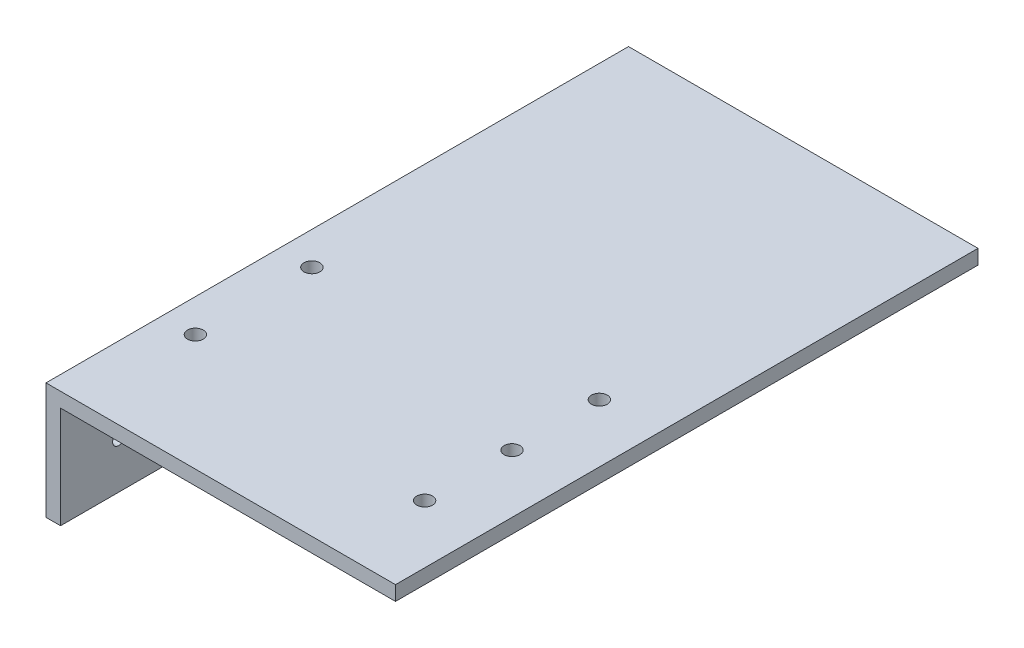
ISO-10303-21;
HEADER;
FILE_DESCRIPTION(('STEP AP214'),'2;1');
FILE_NAME('part.step','',(''),(''),'','','');
FILE_SCHEMA(('AUTOMOTIVE_DESIGN { 1 0 10303 214 1 1 1 1 }'));
ENDSEC;
DATA;
#1=APPLICATION_CONTEXT('core data for automotive mechanical design processes');
#2=APPLICATION_PROTOCOL_DEFINITION('international standard','automotive_design',2000,#1);
#3=PRODUCT_CONTEXT('',#1,'mechanical');
#4=PRODUCT('Part','Part','',(#3));
#5=PRODUCT_RELATED_PRODUCT_CATEGORY('part','',(#4));
#6=PRODUCT_DEFINITION_FORMATION('','',#4);
#7=PRODUCT_DEFINITION_CONTEXT('part definition',#1,'design');
#8=PRODUCT_DEFINITION('design','',#6,#7);
#9=PRODUCT_DEFINITION_SHAPE('','',#8);
#10=(LENGTH_UNIT() NAMED_UNIT(*) SI_UNIT(.MILLI.,.METRE.));
#11=(NAMED_UNIT(*) PLANE_ANGLE_UNIT() SI_UNIT($,.RADIAN.));
#12=(NAMED_UNIT(*) SI_UNIT($,.STERADIAN.) SOLID_ANGLE_UNIT());
#13=UNCERTAINTY_MEASURE_WITH_UNIT(LENGTH_MEASURE(1.E-05),#10,'distance_accuracy_value','');
#14=(GEOMETRIC_REPRESENTATION_CONTEXT(3) GLOBAL_UNCERTAINTY_ASSIGNED_CONTEXT((#13)) GLOBAL_UNIT_ASSIGNED_CONTEXT((#10,
#11,#12)) REPRESENTATION_CONTEXT('',''));
#15=CARTESIAN_POINT('',(0.,0.,0.));
#16=DIRECTION('',(0.,0.,1.));
#17=DIRECTION('',(1.,0.,0.));
#18=AXIS2_PLACEMENT_3D('',#15,#16,#17);
#19=CARTESIAN_POINT('',(0.,-3.17500000000001,76.2));
#20=DIRECTION('',(-1.,0.,0.));
#21=DIRECTION('',(0.,0.,1.));
#22=AXIS2_PLACEMENT_3D('',#19,#20,#21);
#23=PLANE('',#22);
#24=DIRECTION('',(0.,0.,-1.));
#25=VECTOR('',#24,1.);
#26=CARTESIAN_POINT('',(0.,-3.17500000000001,76.2));
#27=LINE('',#26,#25);
#28=CARTESIAN_POINT('',(0.,-3.17500000000001,76.2));
#29=VERTEX_POINT('',#28);
#30=CARTESIAN_POINT('',(0.,-3.17500000000001,-50.8));
#31=VERTEX_POINT('',#30);
#32=EDGE_CURVE('E86',#29,#31,#27,.T.);
#33=ORIENTED_EDGE('',*,*,#32,.T.);
#34=DIRECTION('',(0.,-1.,0.));
#35=VECTOR('',#34,1.);
#36=CARTESIAN_POINT('',(0.,0.,-50.8));
#37=LINE('',#36,#35);
#38=CARTESIAN_POINT('',(0.,0.,-50.8));
#39=VERTEX_POINT('',#38);
#40=EDGE_CURVE('E90',#39,#31,#37,.T.);
#41=ORIENTED_EDGE('',*,*,#40,.F.);
#42=DIRECTION('',(0.,0.,-1.));
#43=VECTOR('',#42,1.);
#44=CARTESIAN_POINT('',(0.,0.,76.2));
#45=LINE('',#44,#43);
#46=CARTESIAN_POINT('',(0.,0.,76.2));
#47=VERTEX_POINT('',#46);
#48=EDGE_CURVE('E11',#47,#39,#45,.T.);
#49=ORIENTED_EDGE('',*,*,#48,.F.);
#50=DIRECTION('',(0.,1.,0.));
#51=VECTOR('',#50,1.);
#52=CARTESIAN_POINT('',(0.,-3.17500000000001,76.2));
#53=LINE('',#52,#51);
#54=EDGE_CURVE('E91',#29,#47,#53,.T.);
#55=ORIENTED_EDGE('',*,*,#54,.F.);
#56=EDGE_LOOP('',(#33,#41,#49,#55));
#57=FACE_BOUND('',#56,.T.);
#58=ADVANCED_FACE('F35',(#57),#23,.F.);
#59=CARTESIAN_POINT('',(0.,0.,76.2));
#60=DIRECTION('',(0.,-1.,0.));
#61=DIRECTION('',(1.,0.,0.));
#62=AXIS2_PLACEMENT_3D('',#59,#60,#61);
#63=PLANE('',#62);
#64=CARTESIAN_POINT('',(-69.0285145614773,0.,25.4));
#65=DIRECTION('',(0.,1.,0.));
#66=DIRECTION('',(0.,0.,1.));
#67=AXIS2_PLACEMENT_3D('',#64,#65,#66);
#68=CIRCLE('',#67,1.72719999999998);
#69=CARTESIAN_POINT('',(-69.0285145614773,0.,27.1272));
#70=VERTEX_POINT('',#69);
#71=EDGE_CURVE('E129',#70,#70,#68,.T.);
#72=ORIENTED_EDGE('',*,*,#71,.F.);
#73=EDGE_LOOP('',(#72));
#74=FACE_BOUND('',#73,.T.);
#75=CARTESIAN_POINT('',(-69.0285145614773,0.,50.8));
#76=DIRECTION('',(0.,1.,0.));
#77=DIRECTION('',(0.,0.,1.));
#78=AXIS2_PLACEMENT_3D('',#75,#76,#77);
#79=CIRCLE('',#78,1.72719999999998);
#80=CARTESIAN_POINT('',(-69.0285145614773,0.,52.5272));
#81=VERTEX_POINT('',#80);
#82=EDGE_CURVE('E135',#81,#81,#79,.T.);
#83=ORIENTED_EDGE('',*,*,#82,.F.);
#84=EDGE_LOOP('',(#83));
#85=FACE_BOUND('',#84,.T.);
#86=CARTESIAN_POINT('',(-12.7,0.,19.05));
#87=DIRECTION('',(0.,1.,0.));
#88=DIRECTION('',(0.,0.,1.));
#89=AXIS2_PLACEMENT_3D('',#86,#87,#88);
#90=CIRCLE('',#89,1.72719999999999);
#91=CARTESIAN_POINT('',(-12.7,0.,20.7772));
#92=VERTEX_POINT('',#91);
#93=EDGE_CURVE('E141',#92,#92,#90,.T.);
#94=ORIENTED_EDGE('',*,*,#93,.F.);
#95=EDGE_LOOP('',(#94));
#96=FACE_BOUND('',#95,.T.);
#97=CARTESIAN_POINT('',(-12.7,0.,38.1));
#98=DIRECTION('',(0.,1.,0.));
#99=DIRECTION('',(0.,0.,1.));
#100=AXIS2_PLACEMENT_3D('',#97,#98,#99);
#101=CIRCLE('',#100,1.72719999999999);
#102=CARTESIAN_POINT('',(-12.7,0.,39.8272));
#103=VERTEX_POINT('',#102);
#104=EDGE_CURVE('E147',#103,#103,#101,.T.);
#105=ORIENTED_EDGE('',*,*,#104,.F.);
#106=EDGE_LOOP('',(#105));
#107=FACE_BOUND('',#106,.T.);
#108=CARTESIAN_POINT('',(-12.7,0.,57.15));
#109=DIRECTION('',(0.,1.,0.));
#110=DIRECTION('',(0.,0.,1.));
#111=AXIS2_PLACEMENT_3D('',#108,#109,#110);
#112=CIRCLE('',#111,1.72719999999999);
#113=CARTESIAN_POINT('',(-12.7,0.,58.8772));
#114=VERTEX_POINT('',#113);
#115=EDGE_CURVE('E153',#114,#114,#112,.T.);
#116=ORIENTED_EDGE('',*,*,#115,.F.);
#117=EDGE_LOOP('',(#116));
#118=FACE_BOUND('',#117,.T.);
#119=ORIENTED_EDGE('',*,*,#48,.T.);
#120=DIRECTION('',(1.,0.,0.));
#121=VECTOR('',#120,1.);
#122=CARTESIAN_POINT('',(-76.2,0.,-50.8));
#123=LINE('',#122,#121);
#124=CARTESIAN_POINT('',(-76.2,0.,-50.8));
#125=VERTEX_POINT('',#124);
#126=EDGE_CURVE('E107',#125,#39,#123,.T.);
#127=ORIENTED_EDGE('',*,*,#126,.F.);
#128=DIRECTION('',(0.,0.,-1.));
#129=VECTOR('',#128,1.);
#130=CARTESIAN_POINT('',(-76.2,0.,76.2));
#131=LINE('',#130,#129);
#132=CARTESIAN_POINT('',(-76.2,0.,76.2));
#133=VERTEX_POINT('',#132);
#134=EDGE_CURVE('E42',#133,#125,#131,.T.);
#135=ORIENTED_EDGE('',*,*,#134,.F.);
#136=DIRECTION('',(-1.,0.,0.));
#137=VECTOR('',#136,1.);
#138=CARTESIAN_POINT('',(0.,0.,76.2));
#139=LINE('',#138,#137);
#140=EDGE_CURVE('E166',#47,#133,#139,.T.);
#141=ORIENTED_EDGE('',*,*,#140,.F.);
#142=EDGE_LOOP('',(#119,#127,#135,#141));
#143=FACE_BOUND('',#142,.T.);
#144=ADVANCED_FACE('F186',(#74,#85,#96,#107,#118,#143),#63,.F.);
#145=CARTESIAN_POINT('',(-76.2,0.,76.2));
#146=DIRECTION('',(1.,0.,0.));
#147=DIRECTION('',(0.,0.,-1.));
#148=AXIS2_PLACEMENT_3D('',#145,#146,#147);
#149=PLANE('',#148);
#150=CARTESIAN_POINT('',(-76.2,-15.24,50.8));
#151=DIRECTION('',(-1.,0.,0.));
#152=DIRECTION('',(0.,0.,1.));
#153=AXIS2_PLACEMENT_3D('',#150,#151,#152);
#154=CIRCLE('',#153,1.35255);
#155=CARTESIAN_POINT('',(-76.2,-15.24,52.15255));
#156=VERTEX_POINT('',#155);
#157=EDGE_CURVE('E117',#156,#156,#154,.T.);
#158=ORIENTED_EDGE('',*,*,#157,.F.);
#159=EDGE_LOOP('',(#158));
#160=FACE_BOUND('',#159,.T.);
#161=CARTESIAN_POINT('',(-76.2,-15.24,63.5));
#162=DIRECTION('',(-1.,0.,0.));
#163=DIRECTION('',(0.,0.,1.));
#164=AXIS2_PLACEMENT_3D('',#161,#162,#163);
#165=CIRCLE('',#164,1.35255);
#166=CARTESIAN_POINT('',(-76.2,-15.24,64.85255));
#167=VERTEX_POINT('',#166);
#168=EDGE_CURVE('E123',#167,#167,#165,.T.);
#169=ORIENTED_EDGE('',*,*,#168,.F.);
#170=EDGE_LOOP('',(#169));
#171=FACE_BOUND('',#170,.T.);
#172=CARTESIAN_POINT('',(-76.2,-15.24,38.1));
#173=DIRECTION('',(-1.,0.,0.));
#174=DIRECTION('',(0.,0.,1.));
#175=AXIS2_PLACEMENT_3D('',#172,#173,#174);
#176=CIRCLE('',#175,3.175);
#177=CARTESIAN_POINT('',(-76.2,-15.24,41.275));
#178=VERTEX_POINT('',#177);
#179=EDGE_CURVE('E159',#178,#178,#176,.T.);
#180=ORIENTED_EDGE('',*,*,#179,.F.);
#181=EDGE_LOOP('',(#180));
#182=FACE_BOUND('',#181,.T.);
#183=ORIENTED_EDGE('',*,*,#134,.T.);
#184=DIRECTION('',(0.,1.,0.));
#185=VECTOR('',#184,1.);
#186=CARTESIAN_POINT('',(-76.2,-25.4,-50.8));
#187=LINE('',#186,#185);
#188=CARTESIAN_POINT('',(-76.2,-25.4,-50.8));
#189=VERTEX_POINT('',#188);
#190=EDGE_CURVE('E114',#189,#125,#187,.T.);
#191=ORIENTED_EDGE('',*,*,#190,.F.);
#192=DIRECTION('',(0.,0.,-1.));
#193=VECTOR('',#192,1.);
#194=CARTESIAN_POINT('',(-76.2,-25.4,76.2));
#195=LINE('',#194,#193);
#196=CARTESIAN_POINT('',(-76.2,-25.4,76.2));
#197=VERTEX_POINT('',#196);
#198=EDGE_CURVE('E177',#197,#189,#195,.T.);
#199=ORIENTED_EDGE('',*,*,#198,.F.);
#200=DIRECTION('',(0.,-1.,0.));
#201=VECTOR('',#200,1.);
#202=CARTESIAN_POINT('',(-76.2,0.,76.2));
#203=LINE('',#202,#201);
#204=EDGE_CURVE('E168',#133,#197,#203,.T.);
#205=ORIENTED_EDGE('',*,*,#204,.F.);
#206=EDGE_LOOP('',(#183,#191,#199,#205));
#207=FACE_BOUND('',#206,.T.);
#208=ADVANCED_FACE('F182',(#160,#171,#182,#207),#149,.F.);
#209=CARTESIAN_POINT('',(-76.2,-25.4,76.2));
#210=DIRECTION('',(0.,1.,0.));
#211=DIRECTION('',(0.,0.,1.));
#212=AXIS2_PLACEMENT_3D('',#209,#210,#211);
#213=PLANE('',#212);
#214=ORIENTED_EDGE('',*,*,#198,.T.);
#215=DIRECTION('',(-1.,0.,0.));
#216=VECTOR('',#215,1.);
#217=CARTESIAN_POINT('',(-73.025,-25.4,-50.8));
#218=LINE('',#217,#216);
#219=CARTESIAN_POINT('',(-73.025,-25.4,-50.8));
#220=VERTEX_POINT('',#219);
#221=EDGE_CURVE('E111',#220,#189,#218,.T.);
#222=ORIENTED_EDGE('',*,*,#221,.F.);
#223=DIRECTION('',(0.,0.,-1.));
#224=VECTOR('',#223,1.);
#225=CARTESIAN_POINT('',(-73.025,-25.4,76.2));
#226=LINE('',#225,#224);
#227=CARTESIAN_POINT('',(-73.025,-25.4,76.2));
#228=VERTEX_POINT('',#227);
#229=EDGE_CURVE('E175',#228,#220,#226,.T.);
#230=ORIENTED_EDGE('',*,*,#229,.F.);
#231=DIRECTION('',(1.,0.,0.));
#232=VECTOR('',#231,1.);
#233=CARTESIAN_POINT('',(-76.2,-25.4,76.2));
#234=LINE('',#233,#232);
#235=EDGE_CURVE('E170',#197,#228,#234,.T.);
#236=ORIENTED_EDGE('',*,*,#235,.F.);
#237=EDGE_LOOP('',(#214,#222,#230,#236));
#238=FACE_BOUND('',#237,.T.);
#239=ADVANCED_FACE('F210',(#238),#213,.F.);
#240=CARTESIAN_POINT('',(-73.025,-25.4,76.2));
#241=DIRECTION('',(-1.,0.,0.));
#242=DIRECTION('',(0.,0.,1.));
#243=AXIS2_PLACEMENT_3D('',#240,#241,#242);
#244=PLANE('',#243);
#245=CARTESIAN_POINT('',(-73.025,-15.24,50.8));
#246=DIRECTION('',(-1.,0.,0.));
#247=DIRECTION('',(0.,0.,1.));
#248=AXIS2_PLACEMENT_3D('',#245,#246,#247);
#249=CIRCLE('',#248,1.35255);
#250=CARTESIAN_POINT('',(-73.025,-15.24,52.15255));
#251=VERTEX_POINT('',#250);
#252=EDGE_CURVE('E120',#251,#251,#249,.T.);
#253=ORIENTED_EDGE('',*,*,#252,.T.);
#254=EDGE_LOOP('',(#253));
#255=FACE_BOUND('',#254,.T.);
#256=CARTESIAN_POINT('',(-73.025,-15.24,63.5));
#257=DIRECTION('',(-1.,0.,0.));
#258=DIRECTION('',(0.,0.,1.));
#259=AXIS2_PLACEMENT_3D('',#256,#257,#258);
#260=CIRCLE('',#259,1.35255);
#261=CARTESIAN_POINT('',(-73.025,-15.24,64.85255));
#262=VERTEX_POINT('',#261);
#263=EDGE_CURVE('E126',#262,#262,#260,.T.);
#264=ORIENTED_EDGE('',*,*,#263,.T.);
#265=EDGE_LOOP('',(#264));
#266=FACE_BOUND('',#265,.T.);
#267=CARTESIAN_POINT('',(-73.025,-15.24,38.1));
#268=DIRECTION('',(-1.,0.,0.));
#269=DIRECTION('',(0.,0.,1.));
#270=AXIS2_PLACEMENT_3D('',#267,#268,#269);
#271=CIRCLE('',#270,3.175);
#272=CARTESIAN_POINT('',(-73.025,-15.24,41.275));
#273=VERTEX_POINT('',#272);
#274=EDGE_CURVE('E162',#273,#273,#271,.F.);
#275=ORIENTED_EDGE('',*,*,#274,.F.);
#276=EDGE_LOOP('',(#275));
#277=FACE_BOUND('',#276,.T.);
#278=ORIENTED_EDGE('',*,*,#229,.T.);
#279=DIRECTION('',(0.,-1.,0.));
#280=VECTOR('',#279,1.);
#281=CARTESIAN_POINT('',(-73.025,-3.17500000000001,-50.8));
#282=LINE('',#281,#280);
#283=CARTESIAN_POINT('',(-73.025,-3.17500000000001,-50.8));
#284=VERTEX_POINT('',#283);
#285=EDGE_CURVE('E101',#284,#220,#282,.T.);
#286=ORIENTED_EDGE('',*,*,#285,.F.);
#287=DIRECTION('',(0.,0.,-1.));
#288=VECTOR('',#287,1.);
#289=CARTESIAN_POINT('',(-73.025,-3.17500000000001,76.2));
#290=LINE('',#289,#288);
#291=CARTESIAN_POINT('',(-73.025,-3.17500000000001,76.2));
#292=VERTEX_POINT('',#291);
#293=EDGE_CURVE('E93',#292,#284,#290,.T.);
#294=ORIENTED_EDGE('',*,*,#293,.F.);
#295=DIRECTION('',(0.,1.,0.));
#296=VECTOR('',#295,1.);
#297=CARTESIAN_POINT('',(-73.025,-25.4,76.2));
#298=LINE('',#297,#296);
#299=EDGE_CURVE('E54',#228,#292,#298,.T.);
#300=ORIENTED_EDGE('',*,*,#299,.F.);
#301=EDGE_LOOP('',(#278,#286,#294,#300));
#302=FACE_BOUND('',#301,.T.);
#303=ADVANCED_FACE('F198',(#255,#266,#277,#302),#244,.F.);
#304=CARTESIAN_POINT('',(-73.025,-3.17500000000001,76.2));
#305=DIRECTION('',(0.,1.,0.));
#306=DIRECTION('',(-1.,0.,0.));
#307=AXIS2_PLACEMENT_3D('',#304,#305,#306);
#308=PLANE('',#307);
#309=CARTESIAN_POINT('',(-69.0285145614773,-3.17500000000001,25.4));
#310=DIRECTION('',(0.,1.,0.));
#311=DIRECTION('',(-1.,0.,0.));
#312=AXIS2_PLACEMENT_3D('',#309,#310,#311);
#313=CIRCLE('',#312,1.72719999999999);
#314=CARTESIAN_POINT('',(-70.7557145614772,-3.17500000000001,25.4));
#315=VERTEX_POINT('',#314);
#316=EDGE_CURVE('E132',#315,#315,#313,.T.);
#317=ORIENTED_EDGE('',*,*,#316,.T.);
#318=EDGE_LOOP('',(#317));
#319=FACE_BOUND('',#318,.T.);
#320=CARTESIAN_POINT('',(-69.0285145614773,-3.17500000000001,50.8));
#321=DIRECTION('',(0.,1.,0.));
#322=DIRECTION('',(-1.,0.,0.));
#323=AXIS2_PLACEMENT_3D('',#320,#321,#322);
#324=CIRCLE('',#323,1.72719999999999);
#325=CARTESIAN_POINT('',(-70.7557145614772,-3.17500000000001,50.8));
#326=VERTEX_POINT('',#325);
#327=EDGE_CURVE('E138',#326,#326,#324,.T.);
#328=ORIENTED_EDGE('',*,*,#327,.T.);
#329=EDGE_LOOP('',(#328));
#330=FACE_BOUND('',#329,.T.);
#331=CARTESIAN_POINT('',(-12.7,-3.17500000000001,19.05));
#332=DIRECTION('',(0.,1.,0.));
#333=DIRECTION('',(-1.,0.,0.));
#334=AXIS2_PLACEMENT_3D('',#331,#332,#333);
#335=CIRCLE('',#334,1.72719999999999);
#336=CARTESIAN_POINT('',(-14.4272,-3.17500000000001,19.05));
#337=VERTEX_POINT('',#336);
#338=EDGE_CURVE('E144',#337,#337,#335,.T.);
#339=ORIENTED_EDGE('',*,*,#338,.T.);
#340=EDGE_LOOP('',(#339));
#341=FACE_BOUND('',#340,.T.);
#342=CARTESIAN_POINT('',(-12.7,-3.17500000000001,38.1));
#343=DIRECTION('',(0.,1.,0.));
#344=DIRECTION('',(-1.,0.,0.));
#345=AXIS2_PLACEMENT_3D('',#342,#343,#344);
#346=CIRCLE('',#345,1.72719999999999);
#347=CARTESIAN_POINT('',(-14.4272,-3.17500000000001,38.1));
#348=VERTEX_POINT('',#347);
#349=EDGE_CURVE('E150',#348,#348,#346,.T.);
#350=ORIENTED_EDGE('',*,*,#349,.T.);
#351=EDGE_LOOP('',(#350));
#352=FACE_BOUND('',#351,.T.);
#353=CARTESIAN_POINT('',(-12.7,-3.17500000000001,57.15));
#354=DIRECTION('',(0.,1.,0.));
#355=DIRECTION('',(-1.,0.,0.));
#356=AXIS2_PLACEMENT_3D('',#353,#354,#355);
#357=CIRCLE('',#356,1.72719999999999);
#358=CARTESIAN_POINT('',(-14.4272,-3.17500000000001,57.15));
#359=VERTEX_POINT('',#358);
#360=EDGE_CURVE('E156',#359,#359,#357,.T.);
#361=ORIENTED_EDGE('',*,*,#360,.T.);
#362=EDGE_LOOP('',(#361));
#363=FACE_BOUND('',#362,.T.);
#364=ORIENTED_EDGE('',*,*,#293,.T.);
#365=DIRECTION('',(-1.,0.,0.));
#366=VECTOR('',#365,1.);
#367=CARTESIAN_POINT('',(0.,-3.17500000000001,-50.8));
#368=LINE('',#367,#366);
#369=EDGE_CURVE('E96',#31,#284,#368,.T.);
#370=ORIENTED_EDGE('',*,*,#369,.F.);
#371=ORIENTED_EDGE('',*,*,#32,.F.);
#372=DIRECTION('',(1.,0.,0.));
#373=VECTOR('',#372,1.);
#374=CARTESIAN_POINT('',(-73.025,-3.17500000000001,76.2));
#375=LINE('',#374,#373);
#376=EDGE_CURVE('E49',#292,#29,#375,.T.);
#377=ORIENTED_EDGE('',*,*,#376,.F.);
#378=EDGE_LOOP('',(#364,#370,#371,#377));
#379=FACE_BOUND('',#378,.T.);
#380=ADVANCED_FACE('F97',(#319,#330,#341,#352,#363,#379),#308,.F.);
#381=CARTESIAN_POINT('',(0.,0.,76.2));
#382=DIRECTION('',(0.,0.,1.));
#383=DIRECTION('',(1.,0.,0.));
#384=AXIS2_PLACEMENT_3D('',#381,#382,#383);
#385=PLANE('',#384);
#386=ORIENTED_EDGE('',*,*,#54,.T.);
#387=ORIENTED_EDGE('',*,*,#140,.T.);
#388=ORIENTED_EDGE('',*,*,#204,.T.);
#389=ORIENTED_EDGE('',*,*,#235,.T.);
#390=ORIENTED_EDGE('',*,*,#299,.T.);
#391=ORIENTED_EDGE('',*,*,#376,.T.);
#392=EDGE_LOOP('',(#386,#387,#388,#389,#390,#391));
#393=FACE_BOUND('',#392,.T.);
#394=ADVANCED_FACE('F187',(#393),#385,.T.);
#395=CARTESIAN_POINT('',(0.001000000000001,-15.24,38.1));
#396=DIRECTION('',(-1.,0.,0.));
#397=DIRECTION('',(0.,0.,1.));
#398=AXIS2_PLACEMENT_3D('',#395,#396,#397);
#399=CYLINDRICAL_SURFACE('',#398,3.175);
#400=ORIENTED_EDGE('',*,*,#179,.T.);
#401=EDGE_LOOP('',(#400));
#402=FACE_BOUND('',#401,.T.);
#403=ORIENTED_EDGE('',*,*,#274,.T.);
#404=EDGE_LOOP('',(#403));
#405=FACE_BOUND('',#404,.T.);
#406=ADVANCED_FACE('F189',(#402,#405),#399,.F.);
#407=CARTESIAN_POINT('',(-12.7,0.,57.15));
#408=DIRECTION('',(0.,1.,0.));
#409=DIRECTION('',(0.,0.,1.));
#410=AXIS2_PLACEMENT_3D('',#407,#408,#409);
#411=CYLINDRICAL_SURFACE('',#410,1.72719999999999);
#412=ORIENTED_EDGE('',*,*,#115,.T.);
#413=EDGE_LOOP('',(#412));
#414=FACE_BOUND('',#413,.T.);
#415=ORIENTED_EDGE('',*,*,#360,.F.);
#416=EDGE_LOOP('',(#415));
#417=FACE_BOUND('',#416,.T.);
#418=ADVANCED_FACE('F194',(#414,#417),#411,.F.);
#419=CARTESIAN_POINT('',(-12.7,0.,38.1));
#420=DIRECTION('',(0.,1.,0.));
#421=DIRECTION('',(0.,0.,1.));
#422=AXIS2_PLACEMENT_3D('',#419,#420,#421);
#423=CYLINDRICAL_SURFACE('',#422,1.72719999999999);
#424=ORIENTED_EDGE('',*,*,#104,.T.);
#425=EDGE_LOOP('',(#424));
#426=FACE_BOUND('',#425,.T.);
#427=ORIENTED_EDGE('',*,*,#349,.F.);
#428=EDGE_LOOP('',(#427));
#429=FACE_BOUND('',#428,.T.);
#430=ADVANCED_FACE('F259',(#426,#429),#423,.F.);
#431=CARTESIAN_POINT('',(-12.7,0.,19.05));
#432=DIRECTION('',(0.,1.,0.));
#433=DIRECTION('',(0.,0.,1.));
#434=AXIS2_PLACEMENT_3D('',#431,#432,#433);
#435=CYLINDRICAL_SURFACE('',#434,1.72719999999999);
#436=ORIENTED_EDGE('',*,*,#93,.T.);
#437=EDGE_LOOP('',(#436));
#438=FACE_BOUND('',#437,.T.);
#439=ORIENTED_EDGE('',*,*,#338,.F.);
#440=EDGE_LOOP('',(#439));
#441=FACE_BOUND('',#440,.T.);
#442=ADVANCED_FACE('F255',(#438,#441),#435,.F.);
#443=CARTESIAN_POINT('',(-69.0285145614773,0.,50.8));
#444=DIRECTION('',(0.,1.,0.));
#445=DIRECTION('',(0.,0.,1.));
#446=AXIS2_PLACEMENT_3D('',#443,#444,#445);
#447=CYLINDRICAL_SURFACE('',#446,1.72719999999999);
#448=ORIENTED_EDGE('',*,*,#327,.F.);
#449=EDGE_LOOP('',(#448));
#450=FACE_BOUND('',#449,.T.);
#451=ORIENTED_EDGE('',*,*,#82,.T.);
#452=EDGE_LOOP('',(#451));
#453=FACE_BOUND('',#452,.T.);
#454=ADVANCED_FACE('F248',(#450,#453),#447,.F.);
#455=CARTESIAN_POINT('',(-69.0285145614773,0.,25.4));
#456=DIRECTION('',(0.,1.,0.));
#457=DIRECTION('',(0.,0.,1.));
#458=AXIS2_PLACEMENT_3D('',#455,#456,#457);
#459=CYLINDRICAL_SURFACE('',#458,1.72719999999999);
#460=ORIENTED_EDGE('',*,*,#316,.F.);
#461=EDGE_LOOP('',(#460));
#462=FACE_BOUND('',#461,.T.);
#463=ORIENTED_EDGE('',*,*,#71,.T.);
#464=EDGE_LOOP('',(#463));
#465=FACE_BOUND('',#464,.T.);
#466=ADVANCED_FACE('F237',(#462,#465),#459,.F.);
#467=CARTESIAN_POINT('',(-76.2,-15.24,63.5));
#468=DIRECTION('',(-1.,0.,0.));
#469=DIRECTION('',(0.,0.,1.));
#470=AXIS2_PLACEMENT_3D('',#467,#468,#469);
#471=CYLINDRICAL_SURFACE('',#470,1.35255);
#472=ORIENTED_EDGE('',*,*,#263,.F.);
#473=EDGE_LOOP('',(#472));
#474=FACE_BOUND('',#473,.T.);
#475=ORIENTED_EDGE('',*,*,#168,.T.);
#476=EDGE_LOOP('',(#475));
#477=FACE_BOUND('',#476,.T.);
#478=ADVANCED_FACE('F233',(#474,#477),#471,.F.);
#479=CARTESIAN_POINT('',(-76.2,-15.24,50.8));
#480=DIRECTION('',(-1.,0.,0.));
#481=DIRECTION('',(0.,0.,1.));
#482=AXIS2_PLACEMENT_3D('',#479,#480,#481);
#483=CYLINDRICAL_SURFACE('',#482,1.35255);
#484=ORIENTED_EDGE('',*,*,#252,.F.);
#485=EDGE_LOOP('',(#484));
#486=FACE_BOUND('',#485,.T.);
#487=ORIENTED_EDGE('',*,*,#157,.T.);
#488=EDGE_LOOP('',(#487));
#489=FACE_BOUND('',#488,.T.);
#490=ADVANCED_FACE('F236',(#486,#489),#483,.F.);
#491=CARTESIAN_POINT('',(0.,0.,-50.8));
#492=DIRECTION('',(0.,0.,-1.));
#493=DIRECTION('',(-1.,0.,0.));
#494=AXIS2_PLACEMENT_3D('',#491,#492,#493);
#495=PLANE('',#494);
#496=ORIENTED_EDGE('',*,*,#40,.T.);
#497=ORIENTED_EDGE('',*,*,#369,.T.);
#498=ORIENTED_EDGE('',*,*,#285,.T.);
#499=ORIENTED_EDGE('',*,*,#221,.T.);
#500=ORIENTED_EDGE('',*,*,#190,.T.);
#501=ORIENTED_EDGE('',*,*,#126,.T.);
#502=EDGE_LOOP('',(#496,#497,#498,#499,#500,#501));
#503=FACE_BOUND('',#502,.T.);
#504=ADVANCED_FACE('F104',(#503),#495,.T.);
#505=CLOSED_SHELL('',(#58,#144,#208,#239,#303,#380,#394,#406,#418,#430,#442,#454,#466,#478,#490,#504));
#506=MANIFOLD_SOLID_BREP('B2',#505);
#507=ADVANCED_BREP_SHAPE_REPRESENTATION('',(#18,#506),#14);
#508=SHAPE_DEFINITION_REPRESENTATION(#9,#507);
ENDSEC;
END-ISO-10303-21;
